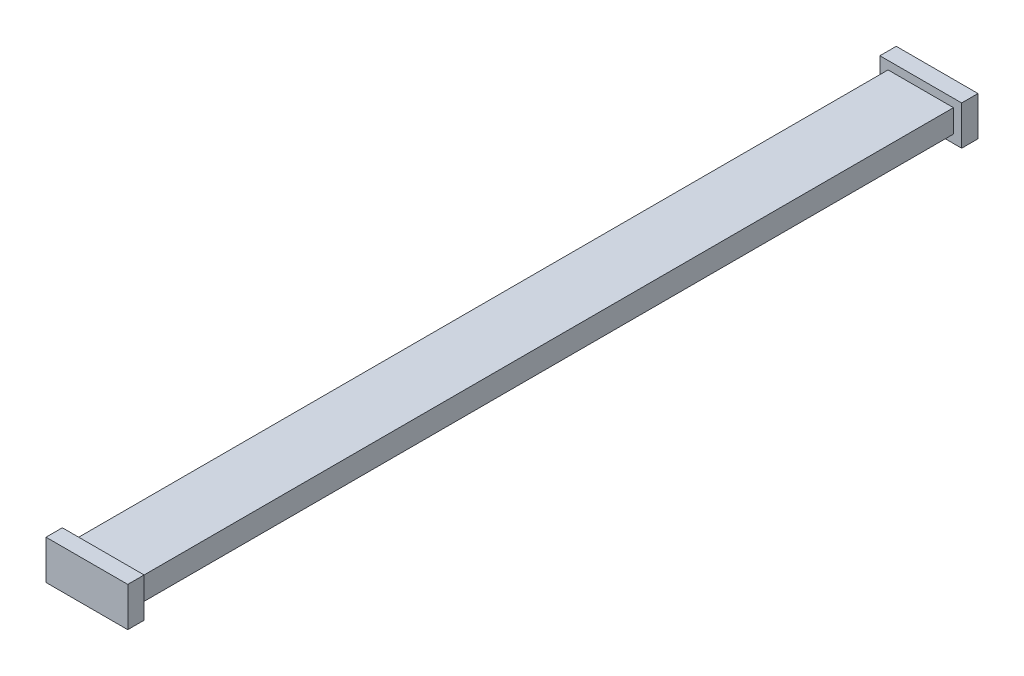
ISO-10303-21;
HEADER;
FILE_DESCRIPTION(('STEP AP214'),'2;1');
FILE_NAME('part.step','',(''),(''),'','','');
FILE_SCHEMA(('AUTOMOTIVE_DESIGN { 1 0 10303 214 1 1 1 1 }'));
ENDSEC;
DATA;
#1=APPLICATION_CONTEXT('core data for automotive mechanical design processes');
#2=APPLICATION_PROTOCOL_DEFINITION('international standard','automotive_design',2000,#1);
#3=PRODUCT_CONTEXT('',#1,'mechanical');
#4=PRODUCT('Part','Part','',(#3));
#5=PRODUCT_RELATED_PRODUCT_CATEGORY('part','',(#4));
#6=PRODUCT_DEFINITION_FORMATION('','',#4);
#7=PRODUCT_DEFINITION_CONTEXT('part definition',#1,'design');
#8=PRODUCT_DEFINITION('design','',#6,#7);
#9=PRODUCT_DEFINITION_SHAPE('','',#8);
#10=(LENGTH_UNIT() NAMED_UNIT(*) SI_UNIT(.MILLI.,.METRE.));
#11=(NAMED_UNIT(*) PLANE_ANGLE_UNIT() SI_UNIT($,.RADIAN.));
#12=(NAMED_UNIT(*) SI_UNIT($,.STERADIAN.) SOLID_ANGLE_UNIT());
#13=UNCERTAINTY_MEASURE_WITH_UNIT(LENGTH_MEASURE(1.E-05),#10,'distance_accuracy_value','');
#14=(GEOMETRIC_REPRESENTATION_CONTEXT(3) GLOBAL_UNCERTAINTY_ASSIGNED_CONTEXT((#13)) GLOBAL_UNIT_ASSIGNED_CONTEXT((#10,
#11,#12)) REPRESENTATION_CONTEXT('',''));
#15=CARTESIAN_POINT('',(0.,0.,0.));
#16=DIRECTION('',(0.,0.,1.));
#17=DIRECTION('',(1.,0.,0.));
#18=AXIS2_PLACEMENT_3D('',#15,#16,#17);
#19=CARTESIAN_POINT('',(10.,3.5,250.));
#20=DIRECTION('',(-1.,0.,0.));
#21=DIRECTION('',(0.,0.,1.));
#22=AXIS2_PLACEMENT_3D('',#19,#20,#21);
#23=PLANE('',#22);
#24=DIRECTION('',(0.,1.,0.));
#25=VECTOR('',#24,1.);
#26=CARTESIAN_POINT('',(10.,3.5,0.));
#27=LINE('',#26,#25);
#28=CARTESIAN_POINT('',(10.,-3.5,0.));
#29=VERTEX_POINT('',#28);
#30=CARTESIAN_POINT('',(10.,3.5,0.));
#31=VERTEX_POINT('',#30);
#32=EDGE_CURVE('E201',#29,#31,#27,.T.);
#33=ORIENTED_EDGE('',*,*,#32,.T.);
#34=DIRECTION('',(0.,0.,-1.));
#35=VECTOR('',#34,1.);
#36=CARTESIAN_POINT('',(10.,3.5,250.));
#37=LINE('',#36,#35);
#38=CARTESIAN_POINT('',(10.,3.5,250.));
#39=VERTEX_POINT('',#38);
#40=EDGE_CURVE('E11',#39,#31,#37,.T.);
#41=ORIENTED_EDGE('',*,*,#40,.F.);
#42=DIRECTION('',(0.,1.,0.));
#43=VECTOR('',#42,1.);
#44=CARTESIAN_POINT('',(10.,3.5,250.));
#45=LINE('',#44,#43);
#46=CARTESIAN_POINT('',(10.,-3.5,250.));
#47=VERTEX_POINT('',#46);
#48=EDGE_CURVE('E202',#47,#39,#45,.T.);
#49=ORIENTED_EDGE('',*,*,#48,.F.);
#50=DIRECTION('',(0.,0.,-1.));
#51=VECTOR('',#50,1.);
#52=CARTESIAN_POINT('',(10.,-3.5,250.));
#53=LINE('',#52,#51);
#54=EDGE_CURVE('E219',#47,#29,#53,.T.);
#55=ORIENTED_EDGE('',*,*,#54,.T.);
#56=EDGE_LOOP('',(#33,#41,#49,#55));
#57=FACE_BOUND('',#56,.T.);
#58=ADVANCED_FACE('F39',(#57),#23,.F.);
#59=CARTESIAN_POINT('',(-10.,3.5,250.));
#60=DIRECTION('',(0.,-1.,0.));
#61=DIRECTION('',(0.,0.,-1.));
#62=AXIS2_PLACEMENT_3D('',#59,#60,#61);
#63=PLANE('',#62);
#64=DIRECTION('',(-1.,0.,0.));
#65=VECTOR('',#64,1.);
#66=CARTESIAN_POINT('',(-10.,3.5,0.));
#67=LINE('',#66,#65);
#68=CARTESIAN_POINT('',(-10.,3.5,0.));
#69=VERTEX_POINT('',#68);
#70=EDGE_CURVE('E223',#31,#69,#67,.T.);
#71=ORIENTED_EDGE('',*,*,#70,.T.);
#72=DIRECTION('',(0.,0.,-1.));
#73=VECTOR('',#72,1.);
#74=CARTESIAN_POINT('',(-10.,3.5,250.));
#75=LINE('',#74,#73);
#76=CARTESIAN_POINT('',(-10.,3.5,250.));
#77=VERTEX_POINT('',#76);
#78=EDGE_CURVE('E48',#77,#69,#75,.T.);
#79=ORIENTED_EDGE('',*,*,#78,.F.);
#80=DIRECTION('',(-1.,0.,0.));
#81=VECTOR('',#80,1.);
#82=CARTESIAN_POINT('',(-10.,3.5,250.));
#83=LINE('',#82,#81);
#84=EDGE_CURVE('E206',#39,#77,#83,.T.);
#85=ORIENTED_EDGE('',*,*,#84,.F.);
#86=ORIENTED_EDGE('',*,*,#40,.T.);
#87=EDGE_LOOP('',(#71,#79,#85,#86));
#88=FACE_BOUND('',#87,.T.);
#89=ADVANCED_FACE('F242',(#88),#63,.F.);
#90=CARTESIAN_POINT('',(-10.,3.5,250.));
#91=DIRECTION('',(1.,0.,0.));
#92=DIRECTION('',(0.,0.,-1.));
#93=AXIS2_PLACEMENT_3D('',#90,#91,#92);
#94=PLANE('',#93);
#95=DIRECTION('',(0.,-1.,0.));
#96=VECTOR('',#95,1.);
#97=CARTESIAN_POINT('',(-10.,3.5,0.));
#98=LINE('',#97,#96);
#99=CARTESIAN_POINT('',(-10.,-3.5,0.));
#100=VERTEX_POINT('',#99);
#101=EDGE_CURVE('E227',#69,#100,#98,.T.);
#102=ORIENTED_EDGE('',*,*,#101,.T.);
#103=DIRECTION('',(0.,0.,-1.));
#104=VECTOR('',#103,1.);
#105=CARTESIAN_POINT('',(-10.,-3.5,250.));
#106=LINE('',#105,#104);
#107=CARTESIAN_POINT('',(-10.,-3.5,250.));
#108=VERTEX_POINT('',#107);
#109=EDGE_CURVE('E55',#108,#100,#106,.T.);
#110=ORIENTED_EDGE('',*,*,#109,.F.);
#111=DIRECTION('',(0.,-1.,0.));
#112=VECTOR('',#111,1.);
#113=CARTESIAN_POINT('',(-10.,3.5,250.));
#114=LINE('',#113,#112);
#115=EDGE_CURVE('E211',#77,#108,#114,.T.);
#116=ORIENTED_EDGE('',*,*,#115,.F.);
#117=ORIENTED_EDGE('',*,*,#78,.T.);
#118=EDGE_LOOP('',(#102,#110,#116,#117));
#119=FACE_BOUND('',#118,.T.);
#120=ADVANCED_FACE('F239',(#119),#94,.F.);
#121=CARTESIAN_POINT('',(-10.,-3.5,250.));
#122=DIRECTION('',(0.,1.,0.));
#123=DIRECTION('',(0.,0.,1.));
#124=AXIS2_PLACEMENT_3D('',#121,#122,#123);
#125=PLANE('',#124);
#126=DIRECTION('',(1.,0.,0.));
#127=VECTOR('',#126,1.);
#128=CARTESIAN_POINT('',(-10.,-3.5,0.));
#129=LINE('',#128,#127);
#130=EDGE_CURVE('E207',#100,#29,#129,.T.);
#131=ORIENTED_EDGE('',*,*,#130,.T.);
#132=ORIENTED_EDGE('',*,*,#54,.F.);
#133=DIRECTION('',(1.,0.,0.));
#134=VECTOR('',#133,1.);
#135=CARTESIAN_POINT('',(-10.,-3.5,250.));
#136=LINE('',#135,#134);
#137=EDGE_CURVE('E215',#108,#47,#136,.T.);
#138=ORIENTED_EDGE('',*,*,#137,.F.);
#139=ORIENTED_EDGE('',*,*,#109,.T.);
#140=EDGE_LOOP('',(#131,#132,#138,#139));
#141=FACE_BOUND('',#140,.T.);
#142=ADVANCED_FACE('F249',(#141),#125,.F.);
#143=CARTESIAN_POINT('',(0.,0.,250.));
#144=DIRECTION('',(0.,0.,1.));
#145=DIRECTION('',(1.,0.,0.));
#146=AXIS2_PLACEMENT_3D('',#143,#144,#145);
#147=PLANE('',#146);
#148=DIRECTION('',(0.,-1.,0.));
#149=VECTOR('',#148,1.);
#150=CARTESIAN_POINT('',(-12.5,-6.,250.));
#151=LINE('',#150,#149);
#152=CARTESIAN_POINT('',(-12.5,6.,250.));
#153=VERTEX_POINT('',#152);
#154=CARTESIAN_POINT('',(-12.5,-6.,250.));
#155=VERTEX_POINT('',#154);
#156=EDGE_CURVE('E153',#153,#155,#151,.T.);
#157=ORIENTED_EDGE('',*,*,#156,.F.);
#158=DIRECTION('',(-1.,0.,0.));
#159=VECTOR('',#158,1.);
#160=CARTESIAN_POINT('',(12.5,6.,250.));
#161=LINE('',#160,#159);
#162=CARTESIAN_POINT('',(12.5,6.,250.));
#163=VERTEX_POINT('',#162);
#164=EDGE_CURVE('E169',#163,#153,#161,.T.);
#165=ORIENTED_EDGE('',*,*,#164,.F.);
#166=DIRECTION('',(0.,1.,0.));
#167=VECTOR('',#166,1.);
#168=CARTESIAN_POINT('',(12.5,-6.,250.));
#169=LINE('',#168,#167);
#170=CARTESIAN_POINT('',(12.5,-6.,250.));
#171=VERTEX_POINT('',#170);
#172=EDGE_CURVE('E181',#171,#163,#169,.T.);
#173=ORIENTED_EDGE('',*,*,#172,.F.);
#174=DIRECTION('',(1.,0.,0.));
#175=VECTOR('',#174,1.);
#176=CARTESIAN_POINT('',(12.5,-6.,250.));
#177=LINE('',#176,#175);
#178=EDGE_CURVE('E158',#155,#171,#177,.T.);
#179=ORIENTED_EDGE('',*,*,#178,.F.);
#180=EDGE_LOOP('',(#157,#165,#173,#179));
#181=FACE_BOUND('',#180,.T.);
#182=ORIENTED_EDGE('',*,*,#137,.T.);
#183=ORIENTED_EDGE('',*,*,#48,.T.);
#184=ORIENTED_EDGE('',*,*,#84,.T.);
#185=ORIENTED_EDGE('',*,*,#115,.T.);
#186=EDGE_LOOP('',(#182,#183,#184,#185));
#187=FACE_BOUND('',#186,.T.);
#188=ADVANCED_FACE('F252',(#181,#187),#147,.F.);
#189=CARTESIAN_POINT('',(-12.5,-6.,255.));
#190=DIRECTION('',(1.,0.,0.));
#191=DIRECTION('',(0.,0.,-1.));
#192=AXIS2_PLACEMENT_3D('',#189,#190,#191);
#193=PLANE('',#192);
#194=ORIENTED_EDGE('',*,*,#156,.T.);
#195=DIRECTION('',(0.,0.,-1.));
#196=VECTOR('',#195,1.);
#197=CARTESIAN_POINT('',(-12.5,-6.,255.));
#198=LINE('',#197,#196);
#199=CARTESIAN_POINT('',(-12.5,-6.,255.));
#200=VERTEX_POINT('',#199);
#201=EDGE_CURVE('E197',#200,#155,#198,.T.);
#202=ORIENTED_EDGE('',*,*,#201,.F.);
#203=DIRECTION('',(0.,-1.,0.));
#204=VECTOR('',#203,1.);
#205=CARTESIAN_POINT('',(-12.5,-6.,255.));
#206=LINE('',#205,#204);
#207=CARTESIAN_POINT('',(-12.5,6.,255.));
#208=VERTEX_POINT('',#207);
#209=EDGE_CURVE('E164',#208,#200,#206,.T.);
#210=ORIENTED_EDGE('',*,*,#209,.F.);
#211=DIRECTION('',(0.,0.,-1.));
#212=VECTOR('',#211,1.);
#213=CARTESIAN_POINT('',(-12.5,6.,255.));
#214=LINE('',#213,#212);
#215=EDGE_CURVE('E177',#208,#153,#214,.T.);
#216=ORIENTED_EDGE('',*,*,#215,.T.);
#217=EDGE_LOOP('',(#194,#202,#210,#216));
#218=FACE_BOUND('',#217,.T.);
#219=ADVANCED_FACE('F254',(#218),#193,.F.);
#220=CARTESIAN_POINT('',(12.5,-6.,255.));
#221=DIRECTION('',(0.,1.,0.));
#222=DIRECTION('',(-1.,0.,0.));
#223=AXIS2_PLACEMENT_3D('',#220,#221,#222);
#224=PLANE('',#223);
#225=ORIENTED_EDGE('',*,*,#178,.T.);
#226=DIRECTION('',(0.,0.,-1.));
#227=VECTOR('',#226,1.);
#228=CARTESIAN_POINT('',(12.5,-6.,255.));
#229=LINE('',#228,#227);
#230=CARTESIAN_POINT('',(12.5,-6.,255.));
#231=VERTEX_POINT('',#230);
#232=EDGE_CURVE('E193',#231,#171,#229,.T.);
#233=ORIENTED_EDGE('',*,*,#232,.F.);
#234=DIRECTION('',(1.,0.,0.));
#235=VECTOR('',#234,1.);
#236=CARTESIAN_POINT('',(12.5,-6.,255.));
#237=LINE('',#236,#235);
#238=EDGE_CURVE('E168',#200,#231,#237,.T.);
#239=ORIENTED_EDGE('',*,*,#238,.F.);
#240=ORIENTED_EDGE('',*,*,#201,.T.);
#241=EDGE_LOOP('',(#225,#233,#239,#240));
#242=FACE_BOUND('',#241,.T.);
#243=ADVANCED_FACE('F261',(#242),#224,.F.);
#244=CARTESIAN_POINT('',(12.5,-6.,255.));
#245=DIRECTION('',(-1.,0.,0.));
#246=DIRECTION('',(0.,0.,1.));
#247=AXIS2_PLACEMENT_3D('',#244,#245,#246);
#248=PLANE('',#247);
#249=ORIENTED_EDGE('',*,*,#172,.T.);
#250=DIRECTION('',(0.,0.,-1.));
#251=VECTOR('',#250,1.);
#252=CARTESIAN_POINT('',(12.5,6.,255.));
#253=LINE('',#252,#251);
#254=CARTESIAN_POINT('',(12.5,6.,255.));
#255=VERTEX_POINT('',#254);
#256=EDGE_CURVE('E189',#255,#163,#253,.T.);
#257=ORIENTED_EDGE('',*,*,#256,.F.);
#258=DIRECTION('',(0.,1.,0.));
#259=VECTOR('',#258,1.);
#260=CARTESIAN_POINT('',(12.5,-6.,255.));
#261=LINE('',#260,#259);
#262=EDGE_CURVE('E172',#231,#255,#261,.T.);
#263=ORIENTED_EDGE('',*,*,#262,.F.);
#264=ORIENTED_EDGE('',*,*,#232,.T.);
#265=EDGE_LOOP('',(#249,#257,#263,#264));
#266=FACE_BOUND('',#265,.T.);
#267=ADVANCED_FACE('F281',(#266),#248,.F.);
#268=CARTESIAN_POINT('',(12.5,6.,255.));
#269=DIRECTION('',(0.,-1.,0.));
#270=DIRECTION('',(1.,0.,0.));
#271=AXIS2_PLACEMENT_3D('',#268,#269,#270);
#272=PLANE('',#271);
#273=ORIENTED_EDGE('',*,*,#164,.T.);
#274=ORIENTED_EDGE('',*,*,#215,.F.);
#275=DIRECTION('',(-1.,0.,0.));
#276=VECTOR('',#275,1.);
#277=CARTESIAN_POINT('',(12.5,6.,255.));
#278=LINE('',#277,#276);
#279=EDGE_CURVE('E175',#255,#208,#278,.T.);
#280=ORIENTED_EDGE('',*,*,#279,.F.);
#281=ORIENTED_EDGE('',*,*,#256,.T.);
#282=EDGE_LOOP('',(#273,#274,#280,#281));
#283=FACE_BOUND('',#282,.T.);
#284=ADVANCED_FACE('F284',(#283),#272,.F.);
#285=CARTESIAN_POINT('',(0.,0.,255.));
#286=DIRECTION('',(0.,0.,1.));
#287=DIRECTION('',(1.,0.,0.));
#288=AXIS2_PLACEMENT_3D('',#285,#286,#287);
#289=PLANE('',#288);
#290=ORIENTED_EDGE('',*,*,#209,.T.);
#291=ORIENTED_EDGE('',*,*,#238,.T.);
#292=ORIENTED_EDGE('',*,*,#262,.T.);
#293=ORIENTED_EDGE('',*,*,#279,.T.);
#294=EDGE_LOOP('',(#290,#291,#292,#293));
#295=FACE_BOUND('',#294,.T.);
#296=ADVANCED_FACE('F287',(#295),#289,.T.);
#297=CARTESIAN_POINT('',(12.5,-6.,-5.));
#298=DIRECTION('',(0.,1.,0.));
#299=DIRECTION('',(-1.,0.,0.));
#300=AXIS2_PLACEMENT_3D('',#297,#298,#299);
#301=PLANE('',#300);
#302=DIRECTION('',(-1.,0.,0.));
#303=VECTOR('',#302,1.);
#304=CARTESIAN_POINT('',(12.5,-6.,0.));
#305=LINE('',#304,#303);
#306=CARTESIAN_POINT('',(12.5,-6.,0.));
#307=VERTEX_POINT('',#306);
#308=CARTESIAN_POINT('',(-12.5,-6.,0.));
#309=VERTEX_POINT('',#308);
#310=EDGE_CURVE('E151',#307,#309,#305,.T.);
#311=ORIENTED_EDGE('',*,*,#310,.T.);
#312=DIRECTION('',(0.,0.,1.));
#313=VECTOR('',#312,1.);
#314=CARTESIAN_POINT('',(-12.5,-6.,-5.));
#315=LINE('',#314,#313);
#316=CARTESIAN_POINT('',(-12.5,-6.,-5.));
#317=VERTEX_POINT('',#316);
#318=EDGE_CURVE('E129',#317,#309,#315,.T.);
#319=ORIENTED_EDGE('',*,*,#318,.F.);
#320=DIRECTION('',(-1.,0.,0.));
#321=VECTOR('',#320,1.);
#322=CARTESIAN_POINT('',(12.5,-6.,-5.));
#323=LINE('',#322,#321);
#324=CARTESIAN_POINT('',(12.5,-6.,-5.));
#325=VERTEX_POINT('',#324);
#326=EDGE_CURVE('E137',#325,#317,#323,.T.);
#327=ORIENTED_EDGE('',*,*,#326,.F.);
#328=DIRECTION('',(0.,0.,1.));
#329=VECTOR('',#328,1.);
#330=CARTESIAN_POINT('',(12.5,-6.,-5.));
#331=LINE('',#330,#329);
#332=EDGE_CURVE('E406',#325,#307,#331,.T.);
#333=ORIENTED_EDGE('',*,*,#332,.T.);
#334=EDGE_LOOP('',(#311,#319,#327,#333));
#335=FACE_BOUND('',#334,.T.);
#336=ADVANCED_FACE('F149',(#335),#301,.F.);
#337=CARTESIAN_POINT('',(-12.5,-6.,-5.));
#338=DIRECTION('',(1.,0.,0.));
#339=DIRECTION('',(0.,0.,-1.));
#340=AXIS2_PLACEMENT_3D('',#337,#338,#339);
#341=PLANE('',#340);
#342=DIRECTION('',(0.,1.,0.));
#343=VECTOR('',#342,1.);
#344=CARTESIAN_POINT('',(-12.5,-6.,0.));
#345=LINE('',#344,#343);
#346=CARTESIAN_POINT('',(-12.5,6.,0.));
#347=VERTEX_POINT('',#346);
#348=EDGE_CURVE('E414',#309,#347,#345,.T.);
#349=ORIENTED_EDGE('',*,*,#348,.T.);
#350=DIRECTION('',(0.,0.,1.));
#351=VECTOR('',#350,1.);
#352=CARTESIAN_POINT('',(-12.5,6.,-5.));
#353=LINE('',#352,#351);
#354=CARTESIAN_POINT('',(-12.5,6.,-5.));
#355=VERTEX_POINT('',#354);
#356=EDGE_CURVE('E132',#355,#347,#353,.T.);
#357=ORIENTED_EDGE('',*,*,#356,.F.);
#358=DIRECTION('',(0.,1.,0.));
#359=VECTOR('',#358,1.);
#360=CARTESIAN_POINT('',(-12.5,-6.,-5.));
#361=LINE('',#360,#359);
#362=EDGE_CURVE('E125',#317,#355,#361,.T.);
#363=ORIENTED_EDGE('',*,*,#362,.F.);
#364=ORIENTED_EDGE('',*,*,#318,.T.);
#365=EDGE_LOOP('',(#349,#357,#363,#364));
#366=FACE_BOUND('',#365,.T.);
#367=ADVANCED_FACE('F127',(#366),#341,.F.);
#368=CARTESIAN_POINT('',(-12.5,6.,-5.));
#369=DIRECTION('',(0.,-1.,0.));
#370=DIRECTION('',(1.,0.,0.));
#371=AXIS2_PLACEMENT_3D('',#368,#369,#370);
#372=PLANE('',#371);
#373=DIRECTION('',(1.,0.,0.));
#374=VECTOR('',#373,1.);
#375=CARTESIAN_POINT('',(-12.5,6.,0.));
#376=LINE('',#375,#374);
#377=CARTESIAN_POINT('',(12.5,6.,0.));
#378=VERTEX_POINT('',#377);
#379=EDGE_CURVE('E410',#347,#378,#376,.T.);
#380=ORIENTED_EDGE('',*,*,#379,.T.);
#381=DIRECTION('',(0.,0.,1.));
#382=VECTOR('',#381,1.);
#383=CARTESIAN_POINT('',(12.5,6.,-5.));
#384=LINE('',#383,#382);
#385=CARTESIAN_POINT('',(12.5,6.,-5.));
#386=VERTEX_POINT('',#385);
#387=EDGE_CURVE('E160',#386,#378,#384,.T.);
#388=ORIENTED_EDGE('',*,*,#387,.F.);
#389=DIRECTION('',(1.,0.,0.));
#390=VECTOR('',#389,1.);
#391=CARTESIAN_POINT('',(-12.5,6.,-5.));
#392=LINE('',#391,#390);
#393=EDGE_CURVE('E136',#355,#386,#392,.T.);
#394=ORIENTED_EDGE('',*,*,#393,.F.);
#395=ORIENTED_EDGE('',*,*,#356,.T.);
#396=EDGE_LOOP('',(#380,#388,#394,#395));
#397=FACE_BOUND('',#396,.T.);
#398=ADVANCED_FACE('F308',(#397),#372,.F.);
#399=CARTESIAN_POINT('',(12.5,6.,-5.));
#400=DIRECTION('',(-1.,0.,0.));
#401=DIRECTION('',(0.,0.,1.));
#402=AXIS2_PLACEMENT_3D('',#399,#400,#401);
#403=PLANE('',#402);
#404=DIRECTION('',(0.,-1.,0.));
#405=VECTOR('',#404,1.);
#406=CARTESIAN_POINT('',(12.5,6.,0.));
#407=LINE('',#406,#405);
#408=EDGE_CURVE('E147',#378,#307,#407,.T.);
#409=ORIENTED_EDGE('',*,*,#408,.T.);
#410=ORIENTED_EDGE('',*,*,#332,.F.);
#411=DIRECTION('',(0.,-1.,0.));
#412=VECTOR('',#411,1.);
#413=CARTESIAN_POINT('',(12.5,6.,-5.));
#414=LINE('',#413,#412);
#415=EDGE_CURVE('E142',#386,#325,#414,.T.);
#416=ORIENTED_EDGE('',*,*,#415,.F.);
#417=ORIENTED_EDGE('',*,*,#387,.T.);
#418=EDGE_LOOP('',(#409,#410,#416,#417));
#419=FACE_BOUND('',#418,.T.);
#420=ADVANCED_FACE('F311',(#419),#403,.F.);
#421=CARTESIAN_POINT('',(0.,0.,-5.));
#422=DIRECTION('',(0.,0.,-1.));
#423=DIRECTION('',(-1.,0.,0.));
#424=AXIS2_PLACEMENT_3D('',#421,#422,#423);
#425=PLANE('',#424);
#426=ORIENTED_EDGE('',*,*,#326,.T.);
#427=ORIENTED_EDGE('',*,*,#362,.T.);
#428=ORIENTED_EDGE('',*,*,#393,.T.);
#429=ORIENTED_EDGE('',*,*,#415,.T.);
#430=EDGE_LOOP('',(#426,#427,#428,#429));
#431=FACE_BOUND('',#430,.T.);
#432=ADVANCED_FACE('F140',(#431),#425,.T.);
#433=CARTESIAN_POINT('',(0.,0.,0.));
#434=DIRECTION('',(0.,0.,-1.));
#435=DIRECTION('',(-1.,0.,0.));
#436=AXIS2_PLACEMENT_3D('',#433,#434,#435);
#437=PLANE('',#436);
#438=ORIENTED_EDGE('',*,*,#32,.F.);
#439=ORIENTED_EDGE('',*,*,#130,.F.);
#440=ORIENTED_EDGE('',*,*,#101,.F.);
#441=ORIENTED_EDGE('',*,*,#70,.F.);
#442=EDGE_LOOP('',(#438,#439,#440,#441));
#443=FACE_BOUND('',#442,.T.);
#444=ORIENTED_EDGE('',*,*,#310,.F.);
#445=ORIENTED_EDGE('',*,*,#408,.F.);
#446=ORIENTED_EDGE('',*,*,#379,.F.);
#447=ORIENTED_EDGE('',*,*,#348,.F.);
#448=EDGE_LOOP('',(#444,#445,#446,#447));
#449=FACE_BOUND('',#448,.T.);
#450=ADVANCED_FACE('F245',(#443,#449),#437,.F.);
#451=CLOSED_SHELL('',(#58,#89,#120,#142,#188,#219,#243,#267,#284,#296,#336,#367,#398,#420,#432,#450));
#452=MANIFOLD_SOLID_BREP('B2',#451);
#453=ADVANCED_BREP_SHAPE_REPRESENTATION('',(#18,#452),#14);
#454=SHAPE_DEFINITION_REPRESENTATION(#9,#453);
ENDSEC;
END-ISO-10303-21;
